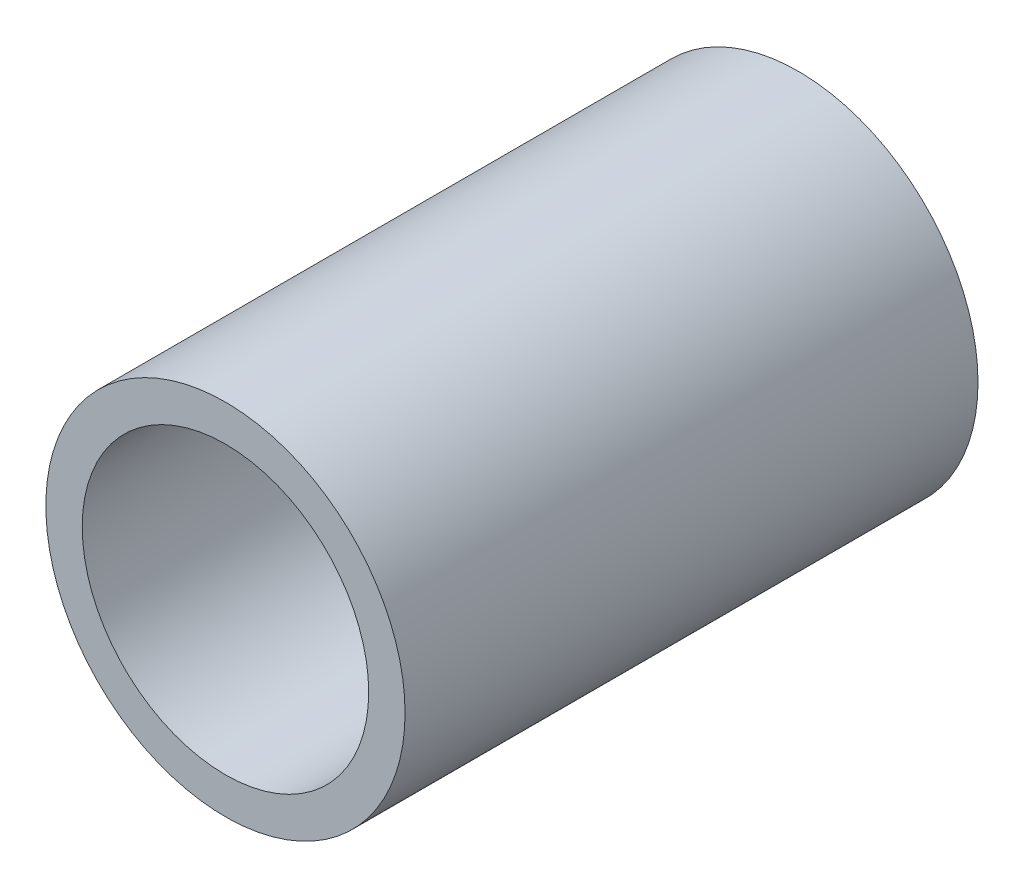
ISO-10303-21;
HEADER;
FILE_DESCRIPTION(('STEP AP214'),'2;1');
FILE_NAME('part.step','',(''),(''),'','','');
FILE_SCHEMA(('AUTOMOTIVE_DESIGN { 1 0 10303 214 1 1 1 1 }'));
ENDSEC;
DATA;
#1=APPLICATION_CONTEXT('core data for automotive mechanical design processes');
#2=APPLICATION_PROTOCOL_DEFINITION('international standard','automotive_design',2000,#1);
#3=PRODUCT_CONTEXT('',#1,'mechanical');
#4=PRODUCT('Part','Part','',(#3));
#5=PRODUCT_RELATED_PRODUCT_CATEGORY('part','',(#4));
#6=PRODUCT_DEFINITION_FORMATION('','',#4);
#7=PRODUCT_DEFINITION_CONTEXT('part definition',#1,'design');
#8=PRODUCT_DEFINITION('design','',#6,#7);
#9=PRODUCT_DEFINITION_SHAPE('','',#8);
#10=(LENGTH_UNIT() NAMED_UNIT(*) SI_UNIT(.MILLI.,.METRE.));
#11=(NAMED_UNIT(*) PLANE_ANGLE_UNIT() SI_UNIT($,.RADIAN.));
#12=(NAMED_UNIT(*) SI_UNIT($,.STERADIAN.) SOLID_ANGLE_UNIT());
#13=UNCERTAINTY_MEASURE_WITH_UNIT(LENGTH_MEASURE(1.E-05),#10,'distance_accuracy_value','');
#14=(GEOMETRIC_REPRESENTATION_CONTEXT(3) GLOBAL_UNCERTAINTY_ASSIGNED_CONTEXT((#13)) GLOBAL_UNIT_ASSIGNED_CONTEXT((#10,
#11,#12)) REPRESENTATION_CONTEXT('',''));
#15=CARTESIAN_POINT('',(0.,0.,0.));
#16=DIRECTION('',(0.,0.,1.));
#17=DIRECTION('',(1.,0.,0.));
#18=AXIS2_PLACEMENT_3D('',#15,#16,#17);
#19=CARTESIAN_POINT('',(0.,0.,12.7));
#20=DIRECTION('',(0.,0.,1.));
#21=DIRECTION('',(1.,0.,0.));
#22=AXIS2_PLACEMENT_3D('',#19,#20,#21);
#23=PLANE('',#22);
#24=CARTESIAN_POINT('',(0.,0.,12.7));
#25=DIRECTION('',(0.,0.,1.));
#26=DIRECTION('',(1.,0.,0.));
#27=AXIS2_PLACEMENT_3D('',#24,#25,#26);
#28=CIRCLE('',#27,7.9629);
#29=CARTESIAN_POINT('',(7.9629,0.,12.7));
#30=VERTEX_POINT('',#29);
#31=EDGE_CURVE('E10',#30,#30,#28,.T.);
#32=ORIENTED_EDGE('',*,*,#31,.T.);
#33=EDGE_LOOP('',(#32));
#34=FACE_BOUND('',#33,.T.);
#35=CARTESIAN_POINT('',(0.,0.,12.7));
#36=DIRECTION('',(0.,0.,1.));
#37=DIRECTION('',(1.,0.,0.));
#38=AXIS2_PLACEMENT_3D('',#35,#36,#37);
#39=CIRCLE('',#38,6.35);
#40=CARTESIAN_POINT('',(6.35,0.,12.7));
#41=VERTEX_POINT('',#40);
#42=EDGE_CURVE('E42',#41,#41,#39,.T.);
#43=ORIENTED_EDGE('',*,*,#42,.F.);
#44=EDGE_LOOP('',(#43));
#45=FACE_BOUND('',#44,.T.);
#46=ADVANCED_FACE('F31',(#34,#45),#23,.T.);
#47=CARTESIAN_POINT('',(0.,0.,-12.7));
#48=DIRECTION('',(0.,0.,1.));
#49=DIRECTION('',(1.,0.,0.));
#50=AXIS2_PLACEMENT_3D('',#47,#48,#49);
#51=PLANE('',#50);
#52=CARTESIAN_POINT('',(0.,0.,-12.7));
#53=DIRECTION('',(0.,0.,1.));
#54=DIRECTION('',(1.,0.,0.));
#55=AXIS2_PLACEMENT_3D('',#52,#53,#54);
#56=CIRCLE('',#55,7.9629);
#57=CARTESIAN_POINT('',(7.9629,0.,-12.7));
#58=VERTEX_POINT('',#57);
#59=EDGE_CURVE('E35',#58,#58,#56,.T.);
#60=ORIENTED_EDGE('',*,*,#59,.F.);
#61=EDGE_LOOP('',(#60));
#62=FACE_BOUND('',#61,.T.);
#63=CARTESIAN_POINT('',(0.,0.,-12.7));
#64=DIRECTION('',(0.,0.,1.));
#65=DIRECTION('',(1.,0.,0.));
#66=AXIS2_PLACEMENT_3D('',#63,#64,#65);
#67=CIRCLE('',#66,6.35);
#68=CARTESIAN_POINT('',(6.35,0.,-12.7));
#69=VERTEX_POINT('',#68);
#70=EDGE_CURVE('E44',#69,#69,#67,.T.);
#71=ORIENTED_EDGE('',*,*,#70,.T.);
#72=EDGE_LOOP('',(#71));
#73=FACE_BOUND('',#72,.T.);
#74=ADVANCED_FACE('F54',(#62,#73),#51,.F.);
#75=CARTESIAN_POINT('',(0.,0.,12.7));
#76=DIRECTION('',(0.,0.,-1.));
#77=DIRECTION('',(-1.,0.,0.));
#78=AXIS2_PLACEMENT_3D('',#75,#76,#77);
#79=CYLINDRICAL_SURFACE('',#78,7.9629);
#80=ORIENTED_EDGE('',*,*,#31,.F.);
#81=EDGE_LOOP('',(#80));
#82=FACE_BOUND('',#81,.T.);
#83=ORIENTED_EDGE('',*,*,#59,.T.);
#84=EDGE_LOOP('',(#83));
#85=FACE_BOUND('',#84,.T.);
#86=ADVANCED_FACE('F33',(#82,#85),#79,.T.);
#87=CARTESIAN_POINT('',(0.,0.,12.7));
#88=DIRECTION('',(0.,0.,-1.));
#89=DIRECTION('',(-1.,0.,0.));
#90=AXIS2_PLACEMENT_3D('',#87,#88,#89);
#91=CYLINDRICAL_SURFACE('',#90,6.35);
#92=ORIENTED_EDGE('',*,*,#42,.T.);
#93=EDGE_LOOP('',(#92));
#94=FACE_BOUND('',#93,.T.);
#95=ORIENTED_EDGE('',*,*,#70,.F.);
#96=EDGE_LOOP('',(#95));
#97=FACE_BOUND('',#96,.T.);
#98=ADVANCED_FACE('F50',(#94,#97),#91,.F.);
#99=CLOSED_SHELL('',(#46,#74,#86,#98));
#100=MANIFOLD_SOLID_BREP('B2',#99);
#101=ADVANCED_BREP_SHAPE_REPRESENTATION('',(#18,#100),#14);
#102=SHAPE_DEFINITION_REPRESENTATION(#9,#101);
ENDSEC;
END-ISO-10303-21;
